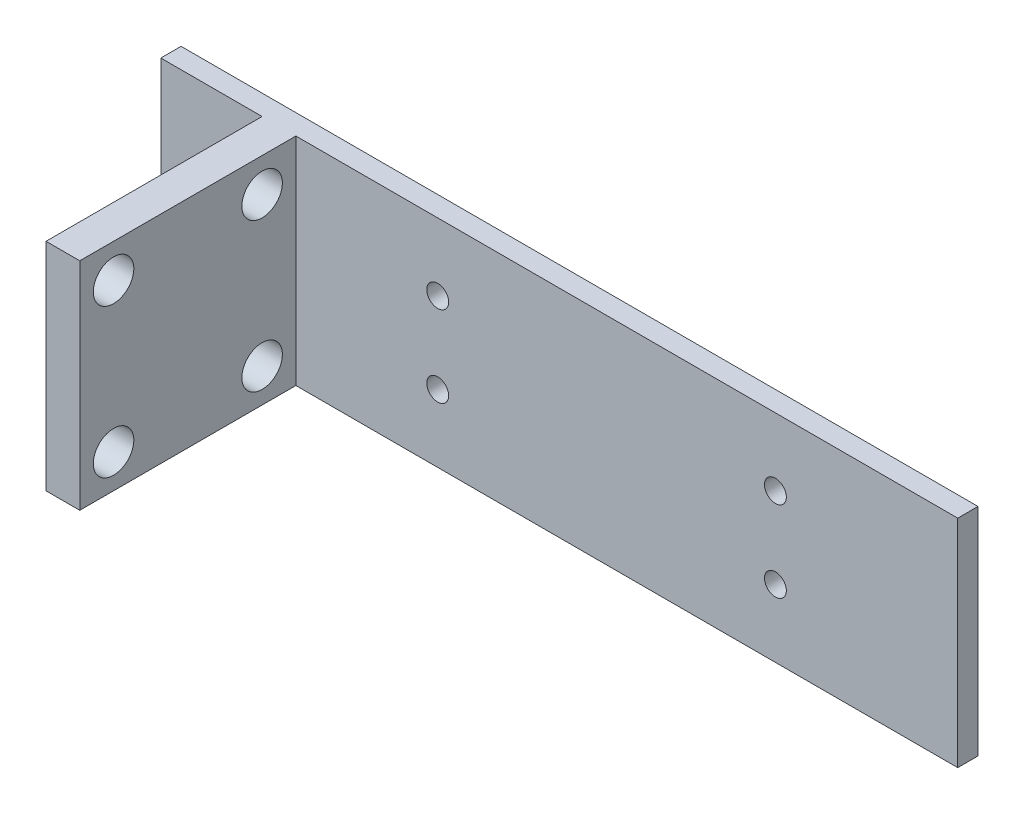
ISO-10303-21;
HEADER;
FILE_DESCRIPTION(('STEP AP214'),'2;1');
FILE_NAME('part.step','',(''),(''),'','','');
FILE_SCHEMA(('AUTOMOTIVE_DESIGN { 1 0 10303 214 1 1 1 1 }'));
ENDSEC;
DATA;
#1=APPLICATION_CONTEXT('core data for automotive mechanical design processes');
#2=APPLICATION_PROTOCOL_DEFINITION('international standard','automotive_design',2000,#1);
#3=PRODUCT_CONTEXT('',#1,'mechanical');
#4=PRODUCT('Part','Part','',(#3));
#5=PRODUCT_RELATED_PRODUCT_CATEGORY('part','',(#4));
#6=PRODUCT_DEFINITION_FORMATION('','',#4);
#7=PRODUCT_DEFINITION_CONTEXT('part definition',#1,'design');
#8=PRODUCT_DEFINITION('design','',#6,#7);
#9=PRODUCT_DEFINITION_SHAPE('','',#8);
#10=(LENGTH_UNIT() NAMED_UNIT(*) SI_UNIT(.MILLI.,.METRE.));
#11=(NAMED_UNIT(*) PLANE_ANGLE_UNIT() SI_UNIT($,.RADIAN.));
#12=(NAMED_UNIT(*) SI_UNIT($,.STERADIAN.) SOLID_ANGLE_UNIT());
#13=UNCERTAINTY_MEASURE_WITH_UNIT(LENGTH_MEASURE(1.E-05),#10,'distance_accuracy_value','');
#14=(GEOMETRIC_REPRESENTATION_CONTEXT(3) GLOBAL_UNCERTAINTY_ASSIGNED_CONTEXT((#13)) GLOBAL_UNIT_ASSIGNED_CONTEXT((#10,
#11,#12)) REPRESENTATION_CONTEXT('',''));
#15=CARTESIAN_POINT('',(0.,0.,0.));
#16=DIRECTION('',(0.,0.,1.));
#17=DIRECTION('',(1.,0.,0.));
#18=AXIS2_PLACEMENT_3D('',#15,#16,#17);
#19=CARTESIAN_POINT('',(0.,0.,3.));
#20=DIRECTION('',(0.,0.,1.));
#21=DIRECTION('',(1.,0.,0.));
#22=AXIS2_PLACEMENT_3D('',#19,#20,#21);
#23=PLANE('',#22);
#24=DIRECTION('',(0.,-1.,0.));
#25=VECTOR('',#24,1.);
#26=CARTESIAN_POINT('',(-56.2816326530612,22.7170068027211,3.));
#27=LINE('',#26,#25);
#28=CARTESIAN_POINT('',(-56.2816326530612,22.7170068027211,3.));
#29=VERTEX_POINT('',#28);
#30=CARTESIAN_POINT('',(-56.2816326530612,-9.28299319727892,3.));
#31=VERTEX_POINT('',#30);
#32=EDGE_CURVE('E58',#29,#31,#27,.T.);
#33=ORIENTED_EDGE('',*,*,#32,.F.);
#34=DIRECTION('',(-1.,0.,0.));
#35=VECTOR('',#34,1.);
#36=CARTESIAN_POINT('',(-71.2816326530612,22.7170068027211,3.));
#37=LINE('',#36,#35);
#38=CARTESIAN_POINT('',(-71.2816326530612,22.7170068027211,3.));
#39=VERTEX_POINT('',#38);
#40=EDGE_CURVE('E168',#29,#39,#37,.T.);
#41=ORIENTED_EDGE('',*,*,#40,.T.);
#42=DIRECTION('',(0.,-1.,0.));
#43=VECTOR('',#42,1.);
#44=CARTESIAN_POINT('',(-71.2816326530612,22.7170068027211,3.));
#45=LINE('',#44,#43);
#46=CARTESIAN_POINT('',(-71.2816326530612,-9.28299319727892,3.));
#47=VERTEX_POINT('',#46);
#48=EDGE_CURVE('E159',#39,#47,#45,.T.);
#49=ORIENTED_EDGE('',*,*,#48,.T.);
#50=DIRECTION('',(1.,0.,0.));
#51=VECTOR('',#50,1.);
#52=CARTESIAN_POINT('',(-71.2816326530612,-9.28299319727892,3.));
#53=LINE('',#52,#51);
#54=EDGE_CURVE('E164',#47,#31,#53,.T.);
#55=ORIENTED_EDGE('',*,*,#54,.T.);
#56=EDGE_LOOP('',(#33,#41,#49,#55));
#57=FACE_BOUND('',#56,.T.);
#58=ADVANCED_FACE('F41',(#57),#23,.T.);
#59=CARTESIAN_POINT('',(-71.2816326530612,22.7170068027211,3.));
#60=DIRECTION('',(1.,0.,0.));
#61=DIRECTION('',(0.,0.,-1.));
#62=AXIS2_PLACEMENT_3D('',#59,#60,#61);
#63=PLANE('',#62);
#64=DIRECTION('',(0.,-1.,0.));
#65=VECTOR('',#64,1.);
#66=CARTESIAN_POINT('',(-71.2816326530612,22.7170068027211,0.));
#67=LINE('',#66,#65);
#68=CARTESIAN_POINT('',(-71.2816326530612,22.7170068027211,0.));
#69=VERTEX_POINT('',#68);
#70=CARTESIAN_POINT('',(-71.2816326530612,-9.28299319727892,0.));
#71=VERTEX_POINT('',#70);
#72=EDGE_CURVE('E156',#69,#71,#67,.T.);
#73=ORIENTED_EDGE('',*,*,#72,.T.);
#74=DIRECTION('',(0.,0.,-1.));
#75=VECTOR('',#74,1.);
#76=CARTESIAN_POINT('',(-71.2816326530612,-9.28299319727892,3.));
#77=LINE('',#76,#75);
#78=EDGE_CURVE('E11',#47,#71,#77,.T.);
#79=ORIENTED_EDGE('',*,*,#78,.F.);
#80=ORIENTED_EDGE('',*,*,#48,.F.);
#81=DIRECTION('',(0.,0.,-1.));
#82=VECTOR('',#81,1.);
#83=CARTESIAN_POINT('',(-71.2816326530612,22.7170068027211,3.));
#84=LINE('',#83,#82);
#85=EDGE_CURVE('E171',#39,#69,#84,.T.);
#86=ORIENTED_EDGE('',*,*,#85,.T.);
#87=EDGE_LOOP('',(#73,#79,#80,#86));
#88=FACE_BOUND('',#87,.T.);
#89=ADVANCED_FACE('F43',(#88),#63,.F.);
#90=CARTESIAN_POINT('',(-71.2816326530612,-9.28299319727892,3.));
#91=DIRECTION('',(0.,1.,0.));
#92=DIRECTION('',(0.,0.,1.));
#93=AXIS2_PLACEMENT_3D('',#90,#91,#92);
#94=PLANE('',#93);
#95=DIRECTION('',(1.,0.,0.));
#96=VECTOR('',#95,1.);
#97=CARTESIAN_POINT('',(-71.2816326530612,-9.28299319727892,0.));
#98=LINE('',#97,#96);
#99=CARTESIAN_POINT('',(46.7183673469388,-9.28299319727892,0.));
#100=VERTEX_POINT('',#99);
#101=EDGE_CURVE('E174',#71,#100,#98,.T.);
#102=ORIENTED_EDGE('',*,*,#101,.T.);
#103=DIRECTION('',(0.,0.,-1.));
#104=VECTOR('',#103,1.);
#105=CARTESIAN_POINT('',(46.7183673469388,-9.28299319727892,3.));
#106=LINE('',#105,#104);
#107=CARTESIAN_POINT('',(46.7183673469388,-9.28299319727892,3.));
#108=VERTEX_POINT('',#107);
#109=EDGE_CURVE('E50',#108,#100,#106,.T.);
#110=ORIENTED_EDGE('',*,*,#109,.F.);
#111=CARTESIAN_POINT('',(-51.2816326530612,-9.28299319727892,3.));
#112=VERTEX_POINT('',#111);
#113=EDGE_CURVE('E162',#112,#108,#53,.T.);
#114=ORIENTED_EDGE('',*,*,#113,.F.);
#115=DIRECTION('',(0.,0.,-1.));
#116=VECTOR('',#115,1.);
#117=CARTESIAN_POINT('',(-51.2816326530612,-9.28299319727892,35.));
#118=LINE('',#117,#116);
#119=CARTESIAN_POINT('',(-51.2816326530612,-9.28299319727892,35.));
#120=VERTEX_POINT('',#119);
#121=EDGE_CURVE('E114',#120,#112,#118,.T.);
#122=ORIENTED_EDGE('',*,*,#121,.F.);
#123=DIRECTION('',(1.,0.,0.));
#124=VECTOR('',#123,1.);
#125=CARTESIAN_POINT('',(-56.2816326530612,-9.28299319727892,35.));
#126=LINE('',#125,#124);
#127=CARTESIAN_POINT('',(-56.2816326530612,-9.28299319727892,35.));
#128=VERTEX_POINT('',#127);
#129=EDGE_CURVE('E108',#128,#120,#126,.T.);
#130=ORIENTED_EDGE('',*,*,#129,.F.);
#131=DIRECTION('',(0.,0.,-1.));
#132=VECTOR('',#131,1.);
#133=CARTESIAN_POINT('',(-56.2816326530612,-9.28299319727892,35.));
#134=LINE('',#133,#132);
#135=EDGE_CURVE('E112',#128,#31,#134,.T.);
#136=ORIENTED_EDGE('',*,*,#135,.T.);
#137=ORIENTED_EDGE('',*,*,#54,.F.);
#138=ORIENTED_EDGE('',*,*,#78,.T.);
#139=EDGE_LOOP('',(#102,#110,#114,#122,#130,#136,#137,#138));
#140=FACE_BOUND('',#139,.T.);
#141=ADVANCED_FACE('F110',(#140),#94,.F.);
#142=CARTESIAN_POINT('',(46.7183673469388,22.7170068027211,3.));
#143=DIRECTION('',(-1.,0.,0.));
#144=DIRECTION('',(0.,0.,1.));
#145=AXIS2_PLACEMENT_3D('',#142,#143,#144);
#146=PLANE('',#145);
#147=DIRECTION('',(0.,1.,0.));
#148=VECTOR('',#147,1.);
#149=CARTESIAN_POINT('',(46.7183673469388,22.7170068027211,0.));
#150=LINE('',#149,#148);
#151=CARTESIAN_POINT('',(46.7183673469388,22.7170068027211,0.));
#152=VERTEX_POINT('',#151);
#153=EDGE_CURVE('E176',#100,#152,#150,.T.);
#154=ORIENTED_EDGE('',*,*,#153,.T.);
#155=DIRECTION('',(0.,0.,-1.));
#156=VECTOR('',#155,1.);
#157=CARTESIAN_POINT('',(46.7183673469388,22.7170068027211,3.));
#158=LINE('',#157,#156);
#159=CARTESIAN_POINT('',(46.7183673469388,22.7170068027211,3.));
#160=VERTEX_POINT('',#159);
#161=EDGE_CURVE('E181',#160,#152,#158,.T.);
#162=ORIENTED_EDGE('',*,*,#161,.F.);
#163=DIRECTION('',(0.,1.,0.));
#164=VECTOR('',#163,1.);
#165=CARTESIAN_POINT('',(46.7183673469388,22.7170068027211,3.));
#166=LINE('',#165,#164);
#167=EDGE_CURVE('E166',#108,#160,#166,.T.);
#168=ORIENTED_EDGE('',*,*,#167,.F.);
#169=ORIENTED_EDGE('',*,*,#109,.T.);
#170=EDGE_LOOP('',(#154,#162,#168,#169));
#171=FACE_BOUND('',#170,.T.);
#172=ADVANCED_FACE('F254',(#171),#146,.F.);
#173=CARTESIAN_POINT('',(-71.2816326530612,22.7170068027211,3.));
#174=DIRECTION('',(0.,-1.,0.));
#175=DIRECTION('',(0.,0.,-1.));
#176=AXIS2_PLACEMENT_3D('',#173,#174,#175);
#177=PLANE('',#176);
#178=DIRECTION('',(-1.,0.,0.));
#179=VECTOR('',#178,1.);
#180=CARTESIAN_POINT('',(-71.2816326530612,22.7170068027211,0.));
#181=LINE('',#180,#179);
#182=EDGE_CURVE('E163',#152,#69,#181,.T.);
#183=ORIENTED_EDGE('',*,*,#182,.T.);
#184=ORIENTED_EDGE('',*,*,#85,.F.);
#185=ORIENTED_EDGE('',*,*,#40,.F.);
#186=DIRECTION('',(0.,0.,-1.));
#187=VECTOR('',#186,1.);
#188=CARTESIAN_POINT('',(-56.2816326530612,22.7170068027211,35.));
#189=LINE('',#188,#187);
#190=CARTESIAN_POINT('',(-56.2816326530612,22.7170068027211,35.));
#191=VERTEX_POINT('',#190);
#192=EDGE_CURVE('E211',#191,#29,#189,.T.);
#193=ORIENTED_EDGE('',*,*,#192,.F.);
#194=DIRECTION('',(-1.,0.,0.));
#195=VECTOR('',#194,1.);
#196=CARTESIAN_POINT('',(-56.2816326530612,22.7170068027211,35.));
#197=LINE('',#196,#195);
#198=CARTESIAN_POINT('',(-51.2816326530612,22.7170068027211,35.));
#199=VERTEX_POINT('',#198);
#200=EDGE_CURVE('E123',#199,#191,#197,.T.);
#201=ORIENTED_EDGE('',*,*,#200,.F.);
#202=DIRECTION('',(0.,0.,-1.));
#203=VECTOR('',#202,1.);
#204=CARTESIAN_POINT('',(-51.2816326530612,22.7170068027211,35.));
#205=LINE('',#204,#203);
#206=CARTESIAN_POINT('',(-51.2816326530612,22.7170068027211,3.));
#207=VERTEX_POINT('',#206);
#208=EDGE_CURVE('E134',#199,#207,#205,.T.);
#209=ORIENTED_EDGE('',*,*,#208,.T.);
#210=EDGE_CURVE('E169',#160,#207,#37,.T.);
#211=ORIENTED_EDGE('',*,*,#210,.F.);
#212=ORIENTED_EDGE('',*,*,#161,.T.);
#213=EDGE_LOOP('',(#183,#184,#185,#193,#201,#209,#211,#212));
#214=FACE_BOUND('',#213,.T.);
#215=ADVANCED_FACE('F218',(#214),#177,.F.);
#216=DIRECTION('',(0.,1.,0.));
#217=VECTOR('',#216,1.);
#218=CARTESIAN_POINT('',(-51.2816326530612,22.7170068027211,3.));
#219=LINE('',#218,#217);
#220=EDGE_CURVE('E66',#112,#207,#219,.T.);
#221=ORIENTED_EDGE('',*,*,#220,.F.);
#222=ORIENTED_EDGE('',*,*,#113,.T.);
#223=ORIENTED_EDGE('',*,*,#167,.T.);
#224=ORIENTED_EDGE('',*,*,#210,.T.);
#225=EDGE_LOOP('',(#221,#222,#223,#224));
#226=FACE_BOUND('',#225,.T.);
#227=CARTESIAN_POINT('',(-30.2816326530612,0.717006802721081,3.));
#228=DIRECTION('',(0.,0.,1.));
#229=DIRECTION('',(1.,0.,0.));
#230=AXIS2_PLACEMENT_3D('',#227,#228,#229);
#231=CIRCLE('',#230,1.62);
#232=CARTESIAN_POINT('',(-28.6616326530612,0.717006802721081,3.));
#233=VERTEX_POINT('',#232);
#234=EDGE_CURVE('E141',#233,#233,#231,.T.);
#235=ORIENTED_EDGE('',*,*,#234,.F.);
#236=EDGE_LOOP('',(#235));
#237=FACE_BOUND('',#236,.T.);
#238=CARTESIAN_POINT('',(19.7183673469388,12.7170068027211,3.));
#239=DIRECTION('',(0.,0.,1.));
#240=DIRECTION('',(1.,0.,0.));
#241=AXIS2_PLACEMENT_3D('',#238,#239,#240);
#242=CIRCLE('',#241,1.62);
#243=CARTESIAN_POINT('',(21.3383673469388,12.7170068027211,3.));
#244=VERTEX_POINT('',#243);
#245=EDGE_CURVE('E148',#244,#244,#242,.T.);
#246=ORIENTED_EDGE('',*,*,#245,.F.);
#247=EDGE_LOOP('',(#246));
#248=FACE_BOUND('',#247,.T.);
#249=CARTESIAN_POINT('',(19.7183673469388,0.717006802721081,3.));
#250=DIRECTION('',(0.,0.,1.));
#251=DIRECTION('',(1.,0.,0.));
#252=AXIS2_PLACEMENT_3D('',#249,#250,#251);
#253=CIRCLE('',#252,1.62);
#254=CARTESIAN_POINT('',(21.3383673469388,0.717006802721081,3.));
#255=VERTEX_POINT('',#254);
#256=EDGE_CURVE('E132',#255,#255,#253,.T.);
#257=ORIENTED_EDGE('',*,*,#256,.F.);
#258=EDGE_LOOP('',(#257));
#259=FACE_BOUND('',#258,.T.);
#260=CARTESIAN_POINT('',(-30.2816326530612,12.7170068027211,3.));
#261=DIRECTION('',(0.,0.,1.));
#262=DIRECTION('',(1.,0.,0.));
#263=AXIS2_PLACEMENT_3D('',#260,#261,#262);
#264=CIRCLE('',#263,1.62000000000001);
#265=CARTESIAN_POINT('',(-28.6616326530612,12.7170068027211,3.));
#266=VERTEX_POINT('',#265);
#267=EDGE_CURVE('E144',#266,#266,#264,.T.);
#268=ORIENTED_EDGE('',*,*,#267,.F.);
#269=EDGE_LOOP('',(#268));
#270=FACE_BOUND('',#269,.T.);
#271=ADVANCED_FACE('F237',(#226,#237,#248,#259,#270),#23,.T.);
#272=CARTESIAN_POINT('',(0.,0.,0.));
#273=DIRECTION('',(0.,0.,1.));
#274=DIRECTION('',(1.,0.,0.));
#275=AXIS2_PLACEMENT_3D('',#272,#273,#274);
#276=PLANE('',#275);
#277=CARTESIAN_POINT('',(-30.2816326530612,0.717006802721081,0.));
#278=DIRECTION('',(0.,0.,1.));
#279=DIRECTION('',(1.,0.,0.));
#280=AXIS2_PLACEMENT_3D('',#277,#278,#279);
#281=CIRCLE('',#280,1.62);
#282=CARTESIAN_POINT('',(-28.6616326530612,0.717006802721081,0.));
#283=VERTEX_POINT('',#282);
#284=EDGE_CURVE('E145',#283,#283,#281,.T.);
#285=ORIENTED_EDGE('',*,*,#284,.T.);
#286=EDGE_LOOP('',(#285));
#287=FACE_BOUND('',#286,.T.);
#288=CARTESIAN_POINT('',(19.7183673469388,12.7170068027211,0.));
#289=DIRECTION('',(0.,0.,1.));
#290=DIRECTION('',(1.,0.,0.));
#291=AXIS2_PLACEMENT_3D('',#288,#289,#290);
#292=CIRCLE('',#291,1.62);
#293=CARTESIAN_POINT('',(21.3383673469388,12.7170068027211,0.));
#294=VERTEX_POINT('',#293);
#295=EDGE_CURVE('E139',#294,#294,#292,.T.);
#296=ORIENTED_EDGE('',*,*,#295,.T.);
#297=EDGE_LOOP('',(#296));
#298=FACE_BOUND('',#297,.T.);
#299=CARTESIAN_POINT('',(19.7183673469388,0.717006802721081,0.));
#300=DIRECTION('',(0.,0.,1.));
#301=DIRECTION('',(1.,0.,0.));
#302=AXIS2_PLACEMENT_3D('',#299,#300,#301);
#303=CIRCLE('',#302,1.62);
#304=CARTESIAN_POINT('',(21.3383673469388,0.717006802721081,0.));
#305=VERTEX_POINT('',#304);
#306=EDGE_CURVE('E129',#305,#305,#303,.T.);
#307=ORIENTED_EDGE('',*,*,#306,.T.);
#308=EDGE_LOOP('',(#307));
#309=FACE_BOUND('',#308,.T.);
#310=CARTESIAN_POINT('',(-30.2816326530612,12.7170068027211,0.));
#311=DIRECTION('',(0.,0.,1.));
#312=DIRECTION('',(1.,0.,0.));
#313=AXIS2_PLACEMENT_3D('',#310,#311,#312);
#314=CIRCLE('',#313,1.62000000000001);
#315=CARTESIAN_POINT('',(-28.6616326530612,12.7170068027211,0.));
#316=VERTEX_POINT('',#315);
#317=EDGE_CURVE('E153',#316,#316,#314,.T.);
#318=ORIENTED_EDGE('',*,*,#317,.T.);
#319=EDGE_LOOP('',(#318));
#320=FACE_BOUND('',#319,.T.);
#321=ORIENTED_EDGE('',*,*,#72,.F.);
#322=ORIENTED_EDGE('',*,*,#182,.F.);
#323=ORIENTED_EDGE('',*,*,#153,.F.);
#324=ORIENTED_EDGE('',*,*,#101,.F.);
#325=EDGE_LOOP('',(#321,#322,#323,#324));
#326=FACE_BOUND('',#325,.T.);
#327=ADVANCED_FACE('F247',(#287,#298,#309,#320,#326),#276,.F.);
#328=CARTESIAN_POINT('',(-30.2816326530612,12.7170068027211,0.));
#329=DIRECTION('',(0.,0.,1.));
#330=DIRECTION('',(1.,0.,0.));
#331=AXIS2_PLACEMENT_3D('',#328,#329,#330);
#332=CYLINDRICAL_SURFACE('',#331,1.62000000000001);
#333=ORIENTED_EDGE('',*,*,#317,.F.);
#334=EDGE_LOOP('',(#333));
#335=FACE_BOUND('',#334,.T.);
#336=ORIENTED_EDGE('',*,*,#267,.T.);
#337=EDGE_LOOP('',(#336));
#338=FACE_BOUND('',#337,.T.);
#339=ADVANCED_FACE('F252',(#335,#338),#332,.F.);
#340=CARTESIAN_POINT('',(19.7183673469388,0.717006802721081,0.));
#341=DIRECTION('',(0.,0.,1.));
#342=DIRECTION('',(1.,0.,0.));
#343=AXIS2_PLACEMENT_3D('',#340,#341,#342);
#344=CYLINDRICAL_SURFACE('',#343,1.62);
#345=ORIENTED_EDGE('',*,*,#306,.F.);
#346=EDGE_LOOP('',(#345));
#347=FACE_BOUND('',#346,.T.);
#348=ORIENTED_EDGE('',*,*,#256,.T.);
#349=EDGE_LOOP('',(#348));
#350=FACE_BOUND('',#349,.T.);
#351=ADVANCED_FACE('F266',(#347,#350),#344,.F.);
#352=CARTESIAN_POINT('',(19.7183673469388,12.7170068027211,0.));
#353=DIRECTION('',(0.,0.,1.));
#354=DIRECTION('',(1.,0.,0.));
#355=AXIS2_PLACEMENT_3D('',#352,#353,#354);
#356=CYLINDRICAL_SURFACE('',#355,1.62);
#357=ORIENTED_EDGE('',*,*,#295,.F.);
#358=EDGE_LOOP('',(#357));
#359=FACE_BOUND('',#358,.T.);
#360=ORIENTED_EDGE('',*,*,#245,.T.);
#361=EDGE_LOOP('',(#360));
#362=FACE_BOUND('',#361,.T.);
#363=ADVANCED_FACE('F271',(#359,#362),#356,.F.);
#364=CARTESIAN_POINT('',(-30.2816326530612,0.717006802721081,0.));
#365=DIRECTION('',(0.,0.,1.));
#366=DIRECTION('',(1.,0.,0.));
#367=AXIS2_PLACEMENT_3D('',#364,#365,#366);
#368=CYLINDRICAL_SURFACE('',#367,1.62);
#369=ORIENTED_EDGE('',*,*,#284,.F.);
#370=EDGE_LOOP('',(#369));
#371=FACE_BOUND('',#370,.T.);
#372=ORIENTED_EDGE('',*,*,#234,.T.);
#373=EDGE_LOOP('',(#372));
#374=FACE_BOUND('',#373,.T.);
#375=ADVANCED_FACE('F231',(#371,#374),#368,.F.);
#376=CARTESIAN_POINT('',(-56.2816326530612,22.7170068027211,35.));
#377=DIRECTION('',(1.,0.,0.));
#378=DIRECTION('',(0.,0.,-1.));
#379=AXIS2_PLACEMENT_3D('',#376,#377,#378);
#380=PLANE('',#379);
#381=CARTESIAN_POINT('',(-56.2816326530612,-4.28299319727892,30.));
#382=DIRECTION('',(1.,0.,0.));
#383=DIRECTION('',(0.,0.,-1.));
#384=AXIS2_PLACEMENT_3D('',#381,#382,#383);
#385=CIRCLE('',#384,3.);
#386=CARTESIAN_POINT('',(-56.2816326530612,-4.28299319727892,27.));
#387=VERTEX_POINT('',#386);
#388=EDGE_CURVE('E206',#387,#387,#385,.T.);
#389=ORIENTED_EDGE('',*,*,#388,.T.);
#390=EDGE_LOOP('',(#389));
#391=FACE_BOUND('',#390,.T.);
#392=CARTESIAN_POINT('',(-56.2816326530612,17.7170068027211,8.));
#393=DIRECTION('',(1.,0.,0.));
#394=DIRECTION('',(0.,0.,-1.));
#395=AXIS2_PLACEMENT_3D('',#392,#393,#394);
#396=CIRCLE('',#395,3.);
#397=CARTESIAN_POINT('',(-56.2816326530612,17.7170068027211,5.));
#398=VERTEX_POINT('',#397);
#399=EDGE_CURVE('E195',#398,#398,#396,.T.);
#400=ORIENTED_EDGE('',*,*,#399,.T.);
#401=EDGE_LOOP('',(#400));
#402=FACE_BOUND('',#401,.T.);
#403=CARTESIAN_POINT('',(-56.2816326530612,-4.28299319727892,8.));
#404=DIRECTION('',(1.,0.,0.));
#405=DIRECTION('',(0.,0.,-1.));
#406=AXIS2_PLACEMENT_3D('',#403,#404,#405);
#407=CIRCLE('',#406,3.);
#408=CARTESIAN_POINT('',(-56.2816326530612,-4.28299319727892,5.));
#409=VERTEX_POINT('',#408);
#410=EDGE_CURVE('E192',#409,#409,#407,.T.);
#411=ORIENTED_EDGE('',*,*,#410,.T.);
#412=EDGE_LOOP('',(#411));
#413=FACE_BOUND('',#412,.T.);
#414=CARTESIAN_POINT('',(-56.2816326530612,17.7170068027211,30.));
#415=DIRECTION('',(1.,0.,0.));
#416=DIRECTION('',(0.,0.,-1.));
#417=AXIS2_PLACEMENT_3D('',#414,#415,#416);
#418=CIRCLE('',#417,3.);
#419=CARTESIAN_POINT('',(-56.2816326530612,17.7170068027211,27.));
#420=VERTEX_POINT('',#419);
#421=EDGE_CURVE('E189',#420,#420,#418,.T.);
#422=ORIENTED_EDGE('',*,*,#421,.T.);
#423=EDGE_LOOP('',(#422));
#424=FACE_BOUND('',#423,.T.);
#425=ORIENTED_EDGE('',*,*,#32,.T.);
#426=ORIENTED_EDGE('',*,*,#135,.F.);
#427=DIRECTION('',(0.,-1.,0.));
#428=VECTOR('',#427,1.);
#429=CARTESIAN_POINT('',(-56.2816326530612,22.7170068027211,35.));
#430=LINE('',#429,#428);
#431=EDGE_CURVE('E118',#191,#128,#430,.T.);
#432=ORIENTED_EDGE('',*,*,#431,.F.);
#433=ORIENTED_EDGE('',*,*,#192,.T.);
#434=EDGE_LOOP('',(#425,#426,#432,#433));
#435=FACE_BOUND('',#434,.T.);
#436=ADVANCED_FACE('F128',(#391,#402,#413,#424,#435),#380,.F.);
#437=CARTESIAN_POINT('',(-51.2816326530612,22.7170068027211,35.));
#438=DIRECTION('',(-1.,0.,0.));
#439=DIRECTION('',(0.,0.,1.));
#440=AXIS2_PLACEMENT_3D('',#437,#438,#439);
#441=PLANE('',#440);
#442=CARTESIAN_POINT('',(-51.2816326530612,-4.28299319727892,30.));
#443=DIRECTION('',(-1.,0.,0.));
#444=DIRECTION('',(0.,0.,1.));
#445=AXIS2_PLACEMENT_3D('',#442,#443,#444);
#446=CIRCLE('',#445,3.);
#447=CARTESIAN_POINT('',(-51.2816326530612,-4.28299319727892,33.));
#448=VERTEX_POINT('',#447);
#449=EDGE_CURVE('E45',#448,#448,#446,.T.);
#450=ORIENTED_EDGE('',*,*,#449,.T.);
#451=EDGE_LOOP('',(#450));
#452=FACE_BOUND('',#451,.T.);
#453=CARTESIAN_POINT('',(-51.2816326530612,17.7170068027211,8.));
#454=DIRECTION('',(-1.,0.,0.));
#455=DIRECTION('',(0.,0.,1.));
#456=AXIS2_PLACEMENT_3D('',#453,#454,#455);
#457=CIRCLE('',#456,3.);
#458=CARTESIAN_POINT('',(-51.2816326530612,17.7170068027211,11.));
#459=VERTEX_POINT('',#458);
#460=EDGE_CURVE('E193',#459,#459,#457,.T.);
#461=ORIENTED_EDGE('',*,*,#460,.T.);
#462=EDGE_LOOP('',(#461));
#463=FACE_BOUND('',#462,.T.);
#464=CARTESIAN_POINT('',(-51.2816326530612,-4.28299319727892,8.));
#465=DIRECTION('',(-1.,0.,0.));
#466=DIRECTION('',(0.,0.,1.));
#467=AXIS2_PLACEMENT_3D('',#464,#465,#466);
#468=CIRCLE('',#467,3.);
#469=CARTESIAN_POINT('',(-51.2816326530612,-4.28299319727892,11.));
#470=VERTEX_POINT('',#469);
#471=EDGE_CURVE('E190',#470,#470,#468,.T.);
#472=ORIENTED_EDGE('',*,*,#471,.T.);
#473=EDGE_LOOP('',(#472));
#474=FACE_BOUND('',#473,.T.);
#475=CARTESIAN_POINT('',(-51.2816326530612,17.7170068027211,30.));
#476=DIRECTION('',(-1.,0.,0.));
#477=DIRECTION('',(0.,0.,1.));
#478=AXIS2_PLACEMENT_3D('',#475,#476,#477);
#479=CIRCLE('',#478,3.);
#480=CARTESIAN_POINT('',(-51.2816326530612,17.7170068027211,33.));
#481=VERTEX_POINT('',#480);
#482=EDGE_CURVE('E186',#481,#481,#479,.T.);
#483=ORIENTED_EDGE('',*,*,#482,.T.);
#484=EDGE_LOOP('',(#483));
#485=FACE_BOUND('',#484,.T.);
#486=ORIENTED_EDGE('',*,*,#220,.T.);
#487=ORIENTED_EDGE('',*,*,#208,.F.);
#488=DIRECTION('',(0.,1.,0.));
#489=VECTOR('',#488,1.);
#490=CARTESIAN_POINT('',(-51.2816326530612,22.7170068027211,35.));
#491=LINE('',#490,#489);
#492=EDGE_CURVE('E117',#120,#199,#491,.T.);
#493=ORIENTED_EDGE('',*,*,#492,.F.);
#494=ORIENTED_EDGE('',*,*,#121,.T.);
#495=EDGE_LOOP('',(#486,#487,#493,#494));
#496=FACE_BOUND('',#495,.T.);
#497=ADVANCED_FACE('F220',(#452,#463,#474,#485,#496),#441,.F.);
#498=CARTESIAN_POINT('',(0.,0.,35.));
#499=DIRECTION('',(0.,0.,1.));
#500=DIRECTION('',(1.,0.,0.));
#501=AXIS2_PLACEMENT_3D('',#498,#499,#500);
#502=PLANE('',#501);
#503=ORIENTED_EDGE('',*,*,#431,.T.);
#504=ORIENTED_EDGE('',*,*,#129,.T.);
#505=ORIENTED_EDGE('',*,*,#492,.T.);
#506=ORIENTED_EDGE('',*,*,#200,.T.);
#507=EDGE_LOOP('',(#503,#504,#505,#506));
#508=FACE_BOUND('',#507,.T.);
#509=ADVANCED_FACE('F121',(#508),#502,.T.);
#510=CARTESIAN_POINT('',(-39.2816326530612,17.7170068027211,30.));
#511=DIRECTION('',(-1.,0.,0.));
#512=DIRECTION('',(0.,0.,1.));
#513=AXIS2_PLACEMENT_3D('',#510,#511,#512);
#514=CYLINDRICAL_SURFACE('',#513,3.);
#515=ORIENTED_EDGE('',*,*,#482,.F.);
#516=EDGE_LOOP('',(#515));
#517=FACE_BOUND('',#516,.T.);
#518=ORIENTED_EDGE('',*,*,#421,.F.);
#519=EDGE_LOOP('',(#518));
#520=FACE_BOUND('',#519,.T.);
#521=ADVANCED_FACE('F229',(#517,#520),#514,.F.);
#522=CARTESIAN_POINT('',(-39.2816326530612,-4.28299319727892,8.));
#523=DIRECTION('',(-1.,0.,0.));
#524=DIRECTION('',(0.,0.,1.));
#525=AXIS2_PLACEMENT_3D('',#522,#523,#524);
#526=CYLINDRICAL_SURFACE('',#525,3.);
#527=ORIENTED_EDGE('',*,*,#471,.F.);
#528=EDGE_LOOP('',(#527));
#529=FACE_BOUND('',#528,.T.);
#530=ORIENTED_EDGE('',*,*,#410,.F.);
#531=EDGE_LOOP('',(#530));
#532=FACE_BOUND('',#531,.T.);
#533=ADVANCED_FACE('F339',(#529,#532),#526,.F.);
#534=CARTESIAN_POINT('',(-39.2816326530612,17.7170068027211,8.));
#535=DIRECTION('',(-1.,0.,0.));
#536=DIRECTION('',(0.,0.,1.));
#537=AXIS2_PLACEMENT_3D('',#534,#535,#536);
#538=CYLINDRICAL_SURFACE('',#537,3.);
#539=ORIENTED_EDGE('',*,*,#460,.F.);
#540=EDGE_LOOP('',(#539));
#541=FACE_BOUND('',#540,.T.);
#542=ORIENTED_EDGE('',*,*,#399,.F.);
#543=EDGE_LOOP('',(#542));
#544=FACE_BOUND('',#543,.T.);
#545=ADVANCED_FACE('F349',(#541,#544),#538,.F.);
#546=CARTESIAN_POINT('',(-39.2816326530612,-4.28299319727892,30.));
#547=DIRECTION('',(-1.,0.,0.));
#548=DIRECTION('',(0.,0.,1.));
#549=AXIS2_PLACEMENT_3D('',#546,#547,#548);
#550=CYLINDRICAL_SURFACE('',#549,3.);
#551=ORIENTED_EDGE('',*,*,#449,.F.);
#552=EDGE_LOOP('',(#551));
#553=FACE_BOUND('',#552,.T.);
#554=ORIENTED_EDGE('',*,*,#388,.F.);
#555=EDGE_LOOP('',(#554));
#556=FACE_BOUND('',#555,.T.);
#557=ADVANCED_FACE('F359',(#553,#556),#550,.F.);
#558=CLOSED_SHELL('',(#58,#89,#141,#172,#215,#271,#327,#339,#351,#363,#375,#436,#497,#509,#521,
#533,#545,#557));
#559=MANIFOLD_SOLID_BREP('B2',#558);
#560=ADVANCED_BREP_SHAPE_REPRESENTATION('',(#18,#559),#14);
#561=SHAPE_DEFINITION_REPRESENTATION(#9,#560);
ENDSEC;
END-ISO-10303-21;
